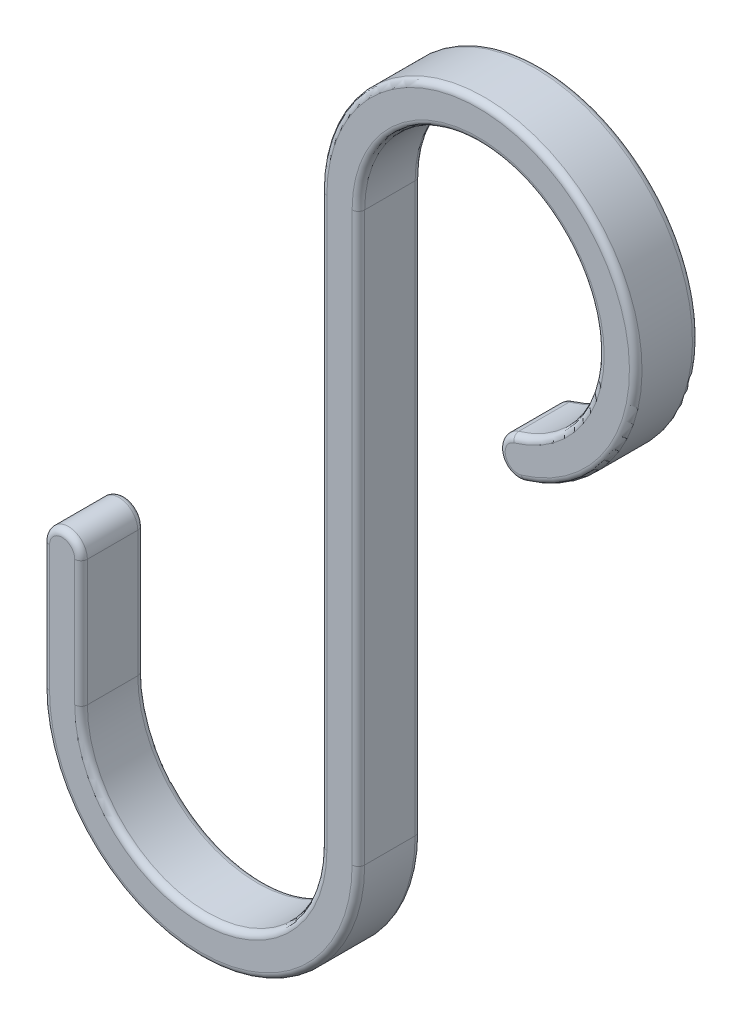
ISO-10303-21;
HEADER;
FILE_DESCRIPTION(('STEP AP214'),'2;1');
FILE_NAME('part.step','',(''),(''),'','','');
FILE_SCHEMA(('AUTOMOTIVE_DESIGN { 1 0 10303 214 1 1 1 1 }'));
ENDSEC;
DATA;
#1=APPLICATION_CONTEXT('core data for automotive mechanical design processes');
#2=APPLICATION_PROTOCOL_DEFINITION('international standard','automotive_design',2000,#1);
#3=PRODUCT_CONTEXT('',#1,'mechanical');
#4=PRODUCT('Part','Part','',(#3));
#5=PRODUCT_RELATED_PRODUCT_CATEGORY('part','',(#4));
#6=PRODUCT_DEFINITION_FORMATION('','',#4);
#7=PRODUCT_DEFINITION_CONTEXT('part definition',#1,'design');
#8=PRODUCT_DEFINITION('design','',#6,#7);
#9=PRODUCT_DEFINITION_SHAPE('','',#8);
#10=(LENGTH_UNIT() NAMED_UNIT(*) SI_UNIT(.MILLI.,.METRE.));
#11=(NAMED_UNIT(*) PLANE_ANGLE_UNIT() SI_UNIT($,.RADIAN.));
#12=(NAMED_UNIT(*) SI_UNIT($,.STERADIAN.) SOLID_ANGLE_UNIT());
#13=UNCERTAINTY_MEASURE_WITH_UNIT(LENGTH_MEASURE(1.E-05),#10,'distance_accuracy_value','');
#14=(GEOMETRIC_REPRESENTATION_CONTEXT(3) GLOBAL_UNCERTAINTY_ASSIGNED_CONTEXT((#13)) GLOBAL_UNIT_ASSIGNED_CONTEXT((#10,
#11,#12)) REPRESENTATION_CONTEXT('',''));
#15=CARTESIAN_POINT('',(0.,0.,0.));
#16=DIRECTION('',(0.,0.,1.));
#17=DIRECTION('',(1.,0.,0.));
#18=AXIS2_PLACEMENT_3D('',#15,#16,#17);
#19=CARTESIAN_POINT('',(-11.,-22.5,5.));
#20=DIRECTION('',(0.,0.,-1.));
#21=DIRECTION('',(-1.,0.,0.));
#22=AXIS2_PLACEMENT_3D('',#19,#20,#21);
#23=CYLINDRICAL_SURFACE('',#22,12.5);
#24=DIRECTION('',(0.,0.,-1.));
#25=VECTOR('',#24,1.);
#26=CARTESIAN_POINT('',(-23.5,-22.5,5.));
#27=LINE('',#26,#25);
#28=CARTESIAN_POINT('',(-23.5,-22.5,4.5));
#29=VERTEX_POINT('',#28);
#30=CARTESIAN_POINT('',(-23.5,-22.5,0.5));
#31=VERTEX_POINT('',#30);
#32=EDGE_CURVE('E219',#29,#31,#27,.T.);
#33=ORIENTED_EDGE('',*,*,#32,.T.);
#34=CARTESIAN_POINT('',(-11.,-22.5,0.5));
#35=DIRECTION('',(0.,0.,-1.));
#36=DIRECTION('',(-1.,0.,0.));
#37=AXIS2_PLACEMENT_3D('',#34,#35,#36);
#38=CIRCLE('',#37,12.5);
#39=CARTESIAN_POINT('',(1.5,-22.5,0.5));
#40=VERTEX_POINT('',#39);
#41=EDGE_CURVE('E297',#31,#40,#38,.F.);
#42=ORIENTED_EDGE('',*,*,#41,.T.);
#43=DIRECTION('',(0.,0.,-1.));
#44=VECTOR('',#43,1.);
#45=CARTESIAN_POINT('',(1.5,-22.5,5.));
#46=LINE('',#45,#44);
#47=CARTESIAN_POINT('',(1.5,-22.5,4.5));
#48=VERTEX_POINT('',#47);
#49=EDGE_CURVE('E211',#48,#40,#46,.T.);
#50=ORIENTED_EDGE('',*,*,#49,.F.);
#51=CARTESIAN_POINT('',(-11.,-22.5,4.5));
#52=DIRECTION('',(0.,0.,-1.));
#53=DIRECTION('',(-1.,0.,0.));
#54=AXIS2_PLACEMENT_3D('',#51,#52,#53);
#55=CIRCLE('',#54,12.5);
#56=EDGE_CURVE('E247',#48,#29,#55,.T.);
#57=ORIENTED_EDGE('',*,*,#56,.T.);
#58=EDGE_LOOP('',(#33,#42,#50,#57));
#59=FACE_BOUND('',#58,.T.);
#60=ADVANCED_FACE('F33',(#59),#23,.T.);
#61=CARTESIAN_POINT('',(1.5,-22.5,5.));
#62=DIRECTION('',(-1.,0.,0.));
#63=DIRECTION('',(0.,-1.,0.));
#64=AXIS2_PLACEMENT_3D('',#61,#62,#63);
#65=PLANE('',#64);
#66=ORIENTED_EDGE('',*,*,#49,.T.);
#67=DIRECTION('',(0.,1.,0.));
#68=VECTOR('',#67,1.);
#69=CARTESIAN_POINT('',(1.5,22.5,0.5));
#70=LINE('',#69,#68);
#71=CARTESIAN_POINT('',(1.5,22.5,0.5));
#72=VERTEX_POINT('',#71);
#73=EDGE_CURVE('E300',#40,#72,#70,.T.);
#74=ORIENTED_EDGE('',*,*,#73,.T.);
#75=DIRECTION('',(0.,0.,-1.));
#76=VECTOR('',#75,1.);
#77=CARTESIAN_POINT('',(1.5,22.5,5.));
#78=LINE('',#77,#76);
#79=CARTESIAN_POINT('',(1.5,22.5,4.5));
#80=VERTEX_POINT('',#79);
#81=EDGE_CURVE('E216',#80,#72,#78,.T.);
#82=ORIENTED_EDGE('',*,*,#81,.F.);
#83=DIRECTION('',(0.,1.,0.));
#84=VECTOR('',#83,1.);
#85=CARTESIAN_POINT('',(1.5,-22.5,4.5));
#86=LINE('',#85,#84);
#87=EDGE_CURVE('E245',#80,#48,#86,.F.);
#88=ORIENTED_EDGE('',*,*,#87,.T.);
#89=EDGE_LOOP('',(#66,#74,#82,#88));
#90=FACE_BOUND('',#89,.T.);
#91=ADVANCED_FACE('F387',(#90),#65,.F.);
#92=CARTESIAN_POINT('',(11.,22.5,5.));
#93=DIRECTION('',(0.,0.,-1.));
#94=DIRECTION('',(-1.,0.,0.));
#95=AXIS2_PLACEMENT_3D('',#92,#93,#94);
#96=CYLINDRICAL_SURFACE('',#95,9.5);
#97=ORIENTED_EDGE('',*,*,#81,.T.);
#98=CARTESIAN_POINT('',(11.,22.5,0.5));
#99=DIRECTION('',(0.,0.,-1.));
#100=DIRECTION('',(-1.,0.,0.));
#101=AXIS2_PLACEMENT_3D('',#98,#99,#100);
#102=CIRCLE('',#101,9.5);
#103=CARTESIAN_POINT('',(13.7136966126587,13.3958333333333,0.5));
#104=VERTEX_POINT('',#103);
#105=EDGE_CURVE('E302',#72,#104,#102,.T.);
#106=ORIENTED_EDGE('',*,*,#105,.T.);
#107=DIRECTION('',(0.,0.,-1.));
#108=VECTOR('',#107,1.);
#109=CARTESIAN_POINT('',(13.7136966126587,13.3958333333333,5.));
#110=LINE('',#109,#108);
#111=CARTESIAN_POINT('',(13.7136966126587,13.3958333333333,4.5));
#112=VERTEX_POINT('',#111);
#113=EDGE_CURVE('E395',#112,#104,#110,.T.);
#114=ORIENTED_EDGE('',*,*,#113,.F.);
#115=CARTESIAN_POINT('',(11.,22.5,4.5));
#116=DIRECTION('',(0.,0.,-1.));
#117=DIRECTION('',(-1.,0.,0.));
#118=AXIS2_PLACEMENT_3D('',#115,#116,#117);
#119=CIRCLE('',#118,9.5);
#120=EDGE_CURVE('E243',#112,#80,#119,.F.);
#121=ORIENTED_EDGE('',*,*,#120,.T.);
#122=EDGE_LOOP('',(#97,#106,#114,#121));
#123=FACE_BOUND('',#122,.T.);
#124=ADVANCED_FACE('F391',(#123),#96,.F.);
#125=CARTESIAN_POINT('',(14.1421750251838,11.9583333333333,5.));
#126=DIRECTION('',(0.,0.,-1.));
#127=DIRECTION('',(-1.,0.,0.));
#128=AXIS2_PLACEMENT_3D('',#125,#126,#127);
#129=CYLINDRICAL_SURFACE('',#128,1.5);
#130=ORIENTED_EDGE('',*,*,#113,.T.);
#131=CARTESIAN_POINT('',(14.1421750251838,11.9583333333333,0.5));
#132=DIRECTION('',(0.,0.,-1.));
#133=DIRECTION('',(-1.,0.,0.));
#134=AXIS2_PLACEMENT_3D('',#131,#132,#133);
#135=CIRCLE('',#134,1.5);
#136=CARTESIAN_POINT('',(14.5706534377089,10.5208333333333,0.5));
#137=VERTEX_POINT('',#136);
#138=EDGE_CURVE('E304',#104,#137,#135,.F.);
#139=ORIENTED_EDGE('',*,*,#138,.T.);
#140=DIRECTION('',(0.,0.,-1.));
#141=VECTOR('',#140,1.);
#142=CARTESIAN_POINT('',(14.5706534377089,10.5208333333333,5.));
#143=LINE('',#142,#141);
#144=CARTESIAN_POINT('',(14.5706534377089,10.5208333333333,4.5));
#145=VERTEX_POINT('',#144);
#146=EDGE_CURVE('E408',#145,#137,#143,.T.);
#147=ORIENTED_EDGE('',*,*,#146,.F.);
#148=CARTESIAN_POINT('',(14.1421750251838,11.9583333333333,4.5));
#149=DIRECTION('',(0.,0.,-1.));
#150=DIRECTION('',(-1.,0.,0.));
#151=AXIS2_PLACEMENT_3D('',#148,#149,#150);
#152=CIRCLE('',#151,1.5);
#153=EDGE_CURVE('E241',#145,#112,#152,.T.);
#154=ORIENTED_EDGE('',*,*,#153,.T.);
#155=EDGE_LOOP('',(#130,#139,#147,#154));
#156=FACE_BOUND('',#155,.T.);
#157=ADVANCED_FACE('F407',(#156),#129,.T.);
#158=CARTESIAN_POINT('',(11.,22.5,5.));
#159=DIRECTION('',(0.,0.,-1.));
#160=DIRECTION('',(-1.,0.,0.));
#161=AXIS2_PLACEMENT_3D('',#158,#159,#160);
#162=CYLINDRICAL_SURFACE('',#161,12.5);
#163=ORIENTED_EDGE('',*,*,#146,.T.);
#164=CARTESIAN_POINT('',(11.,22.5,0.5));
#165=DIRECTION('',(0.,0.,-1.));
#166=DIRECTION('',(-1.,0.,0.));
#167=AXIS2_PLACEMENT_3D('',#164,#165,#166);
#168=CIRCLE('',#167,12.5);
#169=CARTESIAN_POINT('',(-1.5,22.5,0.5));
#170=VERTEX_POINT('',#169);
#171=EDGE_CURVE('E306',#137,#170,#168,.F.);
#172=ORIENTED_EDGE('',*,*,#171,.T.);
#173=DIRECTION('',(0.,0.,-1.));
#174=VECTOR('',#173,1.);
#175=CARTESIAN_POINT('',(-1.5,22.5,5.));
#176=LINE('',#175,#174);
#177=CARTESIAN_POINT('',(-1.5,22.5,4.5));
#178=VERTEX_POINT('',#177);
#179=EDGE_CURVE('E196',#178,#170,#176,.T.);
#180=ORIENTED_EDGE('',*,*,#179,.F.);
#181=CARTESIAN_POINT('',(11.,22.5,4.5));
#182=DIRECTION('',(0.,0.,-1.));
#183=DIRECTION('',(-1.,0.,0.));
#184=AXIS2_PLACEMENT_3D('',#181,#182,#183);
#185=CIRCLE('',#184,12.5);
#186=EDGE_CURVE('E239',#178,#145,#185,.T.);
#187=ORIENTED_EDGE('',*,*,#186,.T.);
#188=EDGE_LOOP('',(#163,#172,#180,#187));
#189=FACE_BOUND('',#188,.T.);
#190=ADVANCED_FACE('F411',(#189),#162,.T.);
#191=CARTESIAN_POINT('',(-1.5,-22.5,5.));
#192=DIRECTION('',(-1.,0.,0.));
#193=DIRECTION('',(0.,-1.,0.));
#194=AXIS2_PLACEMENT_3D('',#191,#192,#193);
#195=PLANE('',#194);
#196=ORIENTED_EDGE('',*,*,#179,.T.);
#197=DIRECTION('',(0.,1.,0.));
#198=VECTOR('',#197,1.);
#199=CARTESIAN_POINT('',(-1.5,-22.5,0.5));
#200=LINE('',#199,#198);
#201=CARTESIAN_POINT('',(-1.5,-22.5,0.5));
#202=VERTEX_POINT('',#201);
#203=EDGE_CURVE('E195',#170,#202,#200,.F.);
#204=ORIENTED_EDGE('',*,*,#203,.T.);
#205=DIRECTION('',(0.,0.,-1.));
#206=VECTOR('',#205,1.);
#207=CARTESIAN_POINT('',(-1.5,-22.5,5.));
#208=LINE('',#207,#206);
#209=CARTESIAN_POINT('',(-1.5,-22.5,4.5));
#210=VERTEX_POINT('',#209);
#211=EDGE_CURVE('E177',#210,#202,#208,.T.);
#212=ORIENTED_EDGE('',*,*,#211,.F.);
#213=DIRECTION('',(0.,1.,0.));
#214=VECTOR('',#213,1.);
#215=CARTESIAN_POINT('',(-1.5,22.5,4.5));
#216=LINE('',#215,#214);
#217=EDGE_CURVE('E192',#210,#178,#216,.T.);
#218=ORIENTED_EDGE('',*,*,#217,.T.);
#219=EDGE_LOOP('',(#196,#204,#212,#218));
#220=FACE_BOUND('',#219,.T.);
#221=ADVANCED_FACE('F190',(#220),#195,.T.);
#222=CARTESIAN_POINT('',(-11.,-22.5,5.));
#223=DIRECTION('',(0.,0.,-1.));
#224=DIRECTION('',(-1.,0.,0.));
#225=AXIS2_PLACEMENT_3D('',#222,#223,#224);
#226=CYLINDRICAL_SURFACE('',#225,9.5);
#227=ORIENTED_EDGE('',*,*,#211,.T.);
#228=CARTESIAN_POINT('',(-11.,-22.5,0.5));
#229=DIRECTION('',(0.,0.,-1.));
#230=DIRECTION('',(-1.,0.,0.));
#231=AXIS2_PLACEMENT_3D('',#228,#229,#230);
#232=CIRCLE('',#231,9.5);
#233=CARTESIAN_POINT('',(-20.5,-22.5,0.5));
#234=VERTEX_POINT('',#233);
#235=EDGE_CURVE('E309',#202,#234,#232,.T.);
#236=ORIENTED_EDGE('',*,*,#235,.T.);
#237=DIRECTION('',(0.,0.,-1.));
#238=VECTOR('',#237,1.);
#239=CARTESIAN_POINT('',(-20.5,-22.5,5.));
#240=LINE('',#239,#238);
#241=CARTESIAN_POINT('',(-20.5,-22.5,4.5));
#242=VERTEX_POINT('',#241);
#243=EDGE_CURVE('E179',#242,#234,#240,.T.);
#244=ORIENTED_EDGE('',*,*,#243,.F.);
#245=CARTESIAN_POINT('',(-11.,-22.5,4.5));
#246=DIRECTION('',(0.,0.,-1.));
#247=DIRECTION('',(-1.,0.,0.));
#248=AXIS2_PLACEMENT_3D('',#245,#246,#247);
#249=CIRCLE('',#248,9.5);
#250=EDGE_CURVE('E174',#242,#210,#249,.F.);
#251=ORIENTED_EDGE('',*,*,#250,.T.);
#252=EDGE_LOOP('',(#227,#236,#244,#251));
#253=FACE_BOUND('',#252,.T.);
#254=ADVANCED_FACE('F176',(#253),#226,.F.);
#255=CARTESIAN_POINT('',(-20.5,-22.5,5.));
#256=DIRECTION('',(-1.,0.,0.));
#257=DIRECTION('',(0.,0.,1.));
#258=AXIS2_PLACEMENT_3D('',#255,#256,#257);
#259=PLANE('',#258);
#260=ORIENTED_EDGE('',*,*,#243,.T.);
#261=DIRECTION('',(0.,1.,0.));
#262=VECTOR('',#261,1.);
#263=CARTESIAN_POINT('',(-20.5,-12.5,0.5));
#264=LINE('',#263,#262);
#265=CARTESIAN_POINT('',(-20.5,-12.5,0.5));
#266=VERTEX_POINT('',#265);
#267=EDGE_CURVE('E57',#234,#266,#264,.T.);
#268=ORIENTED_EDGE('',*,*,#267,.T.);
#269=DIRECTION('',(0.,0.,-1.));
#270=VECTOR('',#269,1.);
#271=CARTESIAN_POINT('',(-20.5,-12.5,5.));
#272=LINE('',#271,#270);
#273=CARTESIAN_POINT('',(-20.5,-12.5,4.5));
#274=VERTEX_POINT('',#273);
#275=EDGE_CURVE('E352',#274,#266,#272,.T.);
#276=ORIENTED_EDGE('',*,*,#275,.F.);
#277=DIRECTION('',(0.,1.,0.));
#278=VECTOR('',#277,1.);
#279=CARTESIAN_POINT('',(-20.5,-22.5,4.5));
#280=LINE('',#279,#278);
#281=EDGE_CURVE('E185',#274,#242,#280,.F.);
#282=ORIENTED_EDGE('',*,*,#281,.T.);
#283=EDGE_LOOP('',(#260,#268,#276,#282));
#284=FACE_BOUND('',#283,.T.);
#285=ADVANCED_FACE('F350',(#284),#259,.F.);
#286=CARTESIAN_POINT('',(-22.,-12.5,5.));
#287=DIRECTION('',(0.,0.,-1.));
#288=DIRECTION('',(-1.,0.,0.));
#289=AXIS2_PLACEMENT_3D('',#286,#287,#288);
#290=CYLINDRICAL_SURFACE('',#289,1.5);
#291=ORIENTED_EDGE('',*,*,#275,.T.);
#292=CARTESIAN_POINT('',(-22.,-12.5,0.5));
#293=DIRECTION('',(0.,0.,-1.));
#294=DIRECTION('',(-1.,0.,0.));
#295=AXIS2_PLACEMENT_3D('',#292,#293,#294);
#296=CIRCLE('',#295,1.5);
#297=CARTESIAN_POINT('',(-23.5,-12.5,0.5));
#298=VERTEX_POINT('',#297);
#299=EDGE_CURVE('E42',#266,#298,#296,.F.);
#300=ORIENTED_EDGE('',*,*,#299,.T.);
#301=DIRECTION('',(0.,0.,-1.));
#302=VECTOR('',#301,1.);
#303=CARTESIAN_POINT('',(-23.5,-12.5,5.));
#304=LINE('',#303,#302);
#305=CARTESIAN_POINT('',(-23.5,-12.5,4.5));
#306=VERTEX_POINT('',#305);
#307=EDGE_CURVE('E354',#306,#298,#304,.T.);
#308=ORIENTED_EDGE('',*,*,#307,.F.);
#309=CARTESIAN_POINT('',(-22.,-12.5,4.5));
#310=DIRECTION('',(0.,0.,-1.));
#311=DIRECTION('',(-1.,0.,0.));
#312=AXIS2_PLACEMENT_3D('',#309,#310,#311);
#313=CIRCLE('',#312,1.5);
#314=EDGE_CURVE('E251',#306,#274,#313,.T.);
#315=ORIENTED_EDGE('',*,*,#314,.T.);
#316=EDGE_LOOP('',(#291,#300,#308,#315));
#317=FACE_BOUND('',#316,.T.);
#318=ADVANCED_FACE('F440',(#317),#290,.T.);
#319=CARTESIAN_POINT('',(-23.5,-22.5,5.));
#320=DIRECTION('',(-1.,0.,0.));
#321=DIRECTION('',(0.,0.,1.));
#322=AXIS2_PLACEMENT_3D('',#319,#320,#321);
#323=PLANE('',#322);
#324=ORIENTED_EDGE('',*,*,#307,.T.);
#325=DIRECTION('',(0.,1.,0.));
#326=VECTOR('',#325,1.);
#327=CARTESIAN_POINT('',(-23.5,-22.5,0.5));
#328=LINE('',#327,#326);
#329=EDGE_CURVE('E11',#298,#31,#328,.F.);
#330=ORIENTED_EDGE('',*,*,#329,.T.);
#331=ORIENTED_EDGE('',*,*,#32,.F.);
#332=DIRECTION('',(0.,1.,0.));
#333=VECTOR('',#332,1.);
#334=CARTESIAN_POINT('',(-23.5,-12.5,4.5));
#335=LINE('',#334,#333);
#336=EDGE_CURVE('E249',#29,#306,#335,.T.);
#337=ORIENTED_EDGE('',*,*,#336,.T.);
#338=EDGE_LOOP('',(#324,#330,#331,#337));
#339=FACE_BOUND('',#338,.T.);
#340=ADVANCED_FACE('F439',(#339),#323,.T.);
#341=CARTESIAN_POINT('',(-11.,-22.5,5.));
#342=DIRECTION('',(0.,0.,-1.));
#343=DIRECTION('',(-1.,0.,0.));
#344=AXIS2_PLACEMENT_3D('',#341,#342,#343);
#345=PLANE('',#344);
#346=CARTESIAN_POINT('',(11.,22.5,5.));
#347=DIRECTION('',(0.,0.,-1.));
#348=DIRECTION('',(-1.,0.,0.));
#349=AXIS2_PLACEMENT_3D('',#346,#347,#348);
#350=CIRCLE('',#349,12.);
#351=CARTESIAN_POINT('',(14.4278273002005,11.,5.));
#352=VERTEX_POINT('',#351);
#353=CARTESIAN_POINT('',(-0.999999999999997,22.5,5.));
#354=VERTEX_POINT('',#353);
#355=EDGE_CURVE('E235',#352,#354,#350,.F.);
#356=ORIENTED_EDGE('',*,*,#355,.T.);
#357=DIRECTION('',(0.,1.,0.));
#358=VECTOR('',#357,1.);
#359=CARTESIAN_POINT('',(-1.,-22.5,5.));
#360=LINE('',#359,#358);
#361=CARTESIAN_POINT('',(-1.,-22.5,5.));
#362=VERTEX_POINT('',#361);
#363=EDGE_CURVE('E237',#354,#362,#360,.F.);
#364=ORIENTED_EDGE('',*,*,#363,.T.);
#365=CARTESIAN_POINT('',(-11.,-22.5,5.));
#366=DIRECTION('',(0.,0.,-1.));
#367=DIRECTION('',(-1.,0.,0.));
#368=AXIS2_PLACEMENT_3D('',#365,#366,#367);
#369=CIRCLE('',#368,10.);
#370=CARTESIAN_POINT('',(-21.,-22.5,5.));
#371=VERTEX_POINT('',#370);
#372=EDGE_CURVE('E201',#362,#371,#369,.T.);
#373=ORIENTED_EDGE('',*,*,#372,.T.);
#374=DIRECTION('',(0.,1.,0.));
#375=VECTOR('',#374,1.);
#376=CARTESIAN_POINT('',(-21.,-22.5,5.));
#377=LINE('',#376,#375);
#378=CARTESIAN_POINT('',(-21.,-12.5,5.));
#379=VERTEX_POINT('',#378);
#380=EDGE_CURVE('E213',#371,#379,#377,.T.);
#381=ORIENTED_EDGE('',*,*,#380,.T.);
#382=CARTESIAN_POINT('',(-22.,-12.5,5.));
#383=DIRECTION('',(0.,0.,-1.));
#384=DIRECTION('',(-1.,0.,0.));
#385=AXIS2_PLACEMENT_3D('',#382,#383,#384);
#386=CIRCLE('',#385,1.);
#387=CARTESIAN_POINT('',(-23.,-12.5,5.));
#388=VERTEX_POINT('',#387);
#389=EDGE_CURVE('E223',#379,#388,#386,.F.);
#390=ORIENTED_EDGE('',*,*,#389,.T.);
#391=DIRECTION('',(0.,1.,0.));
#392=VECTOR('',#391,1.);
#393=CARTESIAN_POINT('',(-23.,-22.5,5.));
#394=LINE('',#393,#392);
#395=CARTESIAN_POINT('',(-23.,-22.5,5.));
#396=VERTEX_POINT('',#395);
#397=EDGE_CURVE('E225',#388,#396,#394,.F.);
#398=ORIENTED_EDGE('',*,*,#397,.T.);
#399=CARTESIAN_POINT('',(-11.,-22.5,5.));
#400=DIRECTION('',(0.,0.,-1.));
#401=DIRECTION('',(-1.,0.,0.));
#402=AXIS2_PLACEMENT_3D('',#399,#400,#401);
#403=CIRCLE('',#402,12.);
#404=CARTESIAN_POINT('',(0.999999999999999,-22.5,5.));
#405=VERTEX_POINT('',#404);
#406=EDGE_CURVE('E227',#396,#405,#403,.F.);
#407=ORIENTED_EDGE('',*,*,#406,.T.);
#408=DIRECTION('',(0.,1.,0.));
#409=VECTOR('',#408,1.);
#410=CARTESIAN_POINT('',(0.999999999999997,-22.5,5.));
#411=LINE('',#410,#409);
#412=CARTESIAN_POINT('',(1.,22.5,5.));
#413=VERTEX_POINT('',#412);
#414=EDGE_CURVE('E229',#405,#413,#411,.T.);
#415=ORIENTED_EDGE('',*,*,#414,.T.);
#416=CARTESIAN_POINT('',(11.,22.5,5.));
#417=DIRECTION('',(0.,0.,-1.));
#418=DIRECTION('',(-1.,0.,0.));
#419=AXIS2_PLACEMENT_3D('',#416,#417,#418);
#420=CIRCLE('',#419,10.);
#421=CARTESIAN_POINT('',(13.8565227501671,12.9166666666667,5.));
#422=VERTEX_POINT('',#421);
#423=EDGE_CURVE('E231',#413,#422,#420,.T.);
#424=ORIENTED_EDGE('',*,*,#423,.T.);
#425=CARTESIAN_POINT('',(14.1421750251838,11.9583333333333,5.));
#426=DIRECTION('',(0.,0.,-1.));
#427=DIRECTION('',(-1.,0.,0.));
#428=AXIS2_PLACEMENT_3D('',#425,#426,#427);
#429=CIRCLE('',#428,0.999999999999999);
#430=EDGE_CURVE('E233',#422,#352,#429,.F.);
#431=ORIENTED_EDGE('',*,*,#430,.T.);
#432=EDGE_LOOP('',(#356,#364,#373,#381,#390,#398,#407,#415,#424,#431));
#433=FACE_BOUND('',#432,.T.);
#434=ADVANCED_FACE('F450',(#433),#345,.F.);
#435=CARTESIAN_POINT('',(-11.,-22.5,0.));
#436=DIRECTION('',(0.,0.,-1.));
#437=DIRECTION('',(-1.,0.,0.));
#438=AXIS2_PLACEMENT_3D('',#435,#436,#437);
#439=PLANE('',#438);
#440=DIRECTION('',(0.,1.,0.));
#441=VECTOR('',#440,1.);
#442=CARTESIAN_POINT('',(0.999999999999998,-22.5,0.));
#443=LINE('',#442,#441);
#444=CARTESIAN_POINT('',(1.,22.5,0.));
#445=VERTEX_POINT('',#444);
#446=CARTESIAN_POINT('',(0.999999999999998,-22.5,0.));
#447=VERTEX_POINT('',#446);
#448=EDGE_CURVE('E292',#445,#447,#443,.F.);
#449=ORIENTED_EDGE('',*,*,#448,.T.);
#450=CARTESIAN_POINT('',(-11.,-22.5,0.));
#451=DIRECTION('',(0.,0.,-1.));
#452=DIRECTION('',(-1.,0.,0.));
#453=AXIS2_PLACEMENT_3D('',#450,#451,#452);
#454=CIRCLE('',#453,12.);
#455=CARTESIAN_POINT('',(-23.,-22.5,0.));
#456=VERTEX_POINT('',#455);
#457=EDGE_CURVE('E294',#447,#456,#454,.T.);
#458=ORIENTED_EDGE('',*,*,#457,.T.);
#459=DIRECTION('',(0.,1.,0.));
#460=VECTOR('',#459,1.);
#461=CARTESIAN_POINT('',(-23.,-22.5,0.));
#462=LINE('',#461,#460);
#463=CARTESIAN_POINT('',(-23.,-12.5,0.));
#464=VERTEX_POINT('',#463);
#465=EDGE_CURVE('E184',#456,#464,#462,.T.);
#466=ORIENTED_EDGE('',*,*,#465,.T.);
#467=CARTESIAN_POINT('',(-22.,-12.5,0.));
#468=DIRECTION('',(0.,0.,-1.));
#469=DIRECTION('',(-1.,0.,0.));
#470=AXIS2_PLACEMENT_3D('',#467,#468,#469);
#471=CIRCLE('',#470,1.);
#472=CARTESIAN_POINT('',(-21.,-12.5,0.));
#473=VERTEX_POINT('',#472);
#474=EDGE_CURVE('E278',#464,#473,#471,.T.);
#475=ORIENTED_EDGE('',*,*,#474,.T.);
#476=DIRECTION('',(0.,1.,0.));
#477=VECTOR('',#476,1.);
#478=CARTESIAN_POINT('',(-21.,-22.5,0.));
#479=LINE('',#478,#477);
#480=CARTESIAN_POINT('',(-21.,-22.5,0.));
#481=VERTEX_POINT('',#480);
#482=EDGE_CURVE('E280',#473,#481,#479,.F.);
#483=ORIENTED_EDGE('',*,*,#482,.T.);
#484=CARTESIAN_POINT('',(-11.,-22.5,0.));
#485=DIRECTION('',(0.,0.,-1.));
#486=DIRECTION('',(-1.,0.,0.));
#487=AXIS2_PLACEMENT_3D('',#484,#485,#486);
#488=CIRCLE('',#487,10.);
#489=CARTESIAN_POINT('',(-1.,-22.5,0.));
#490=VERTEX_POINT('',#489);
#491=EDGE_CURVE('E282',#481,#490,#488,.F.);
#492=ORIENTED_EDGE('',*,*,#491,.T.);
#493=DIRECTION('',(0.,1.,0.));
#494=VECTOR('',#493,1.);
#495=CARTESIAN_POINT('',(-0.999999999999999,-22.5,0.));
#496=LINE('',#495,#494);
#497=CARTESIAN_POINT('',(-1.,22.5,0.));
#498=VERTEX_POINT('',#497);
#499=EDGE_CURVE('E284',#490,#498,#496,.T.);
#500=ORIENTED_EDGE('',*,*,#499,.T.);
#501=CARTESIAN_POINT('',(11.,22.5,0.));
#502=DIRECTION('',(0.,0.,-1.));
#503=DIRECTION('',(-1.,0.,0.));
#504=AXIS2_PLACEMENT_3D('',#501,#502,#503);
#505=CIRCLE('',#504,12.);
#506=CARTESIAN_POINT('',(14.4278273002005,11.,0.));
#507=VERTEX_POINT('',#506);
#508=EDGE_CURVE('E286',#498,#507,#505,.T.);
#509=ORIENTED_EDGE('',*,*,#508,.T.);
#510=CARTESIAN_POINT('',(14.1421750251838,11.9583333333333,0.));
#511=DIRECTION('',(0.,0.,-1.));
#512=DIRECTION('',(-1.,0.,0.));
#513=AXIS2_PLACEMENT_3D('',#510,#511,#512);
#514=CIRCLE('',#513,0.999999999999999);
#515=CARTESIAN_POINT('',(13.8565227501671,12.9166666666667,0.));
#516=VERTEX_POINT('',#515);
#517=EDGE_CURVE('E288',#507,#516,#514,.T.);
#518=ORIENTED_EDGE('',*,*,#517,.T.);
#519=CARTESIAN_POINT('',(11.,22.5,0.));
#520=DIRECTION('',(0.,0.,-1.));
#521=DIRECTION('',(-1.,0.,0.));
#522=AXIS2_PLACEMENT_3D('',#519,#520,#521);
#523=CIRCLE('',#522,10.);
#524=EDGE_CURVE('E290',#516,#445,#523,.F.);
#525=ORIENTED_EDGE('',*,*,#524,.T.);
#526=EDGE_LOOP('',(#449,#458,#466,#475,#483,#492,#500,#509,#518,#525));
#527=FACE_BOUND('',#526,.T.);
#528=ADVANCED_FACE('F378',(#527),#439,.T.);
#529=CARTESIAN_POINT('',(-11.,-22.5,4.5));
#530=DIRECTION('',(0.,0.,-1.));
#531=DIRECTION('',(-1.,0.,0.));
#532=AXIS2_PLACEMENT_3D('',#529,#530,#531);
#533=TOROIDAL_SURFACE('',#532,12.,0.5);
#534=CARTESIAN_POINT('',(0.999999999999999,-22.5,4.5));
#535=DIRECTION('',(0.,1.,0.));
#536=DIRECTION('',(0.,0.,1.));
#537=AXIS2_PLACEMENT_3D('',#534,#535,#536);
#538=CIRCLE('',#537,0.5);
#539=EDGE_CURVE('E271',#405,#48,#538,.T.);
#540=ORIENTED_EDGE('',*,*,#539,.F.);
#541=ORIENTED_EDGE('',*,*,#406,.F.);
#542=CARTESIAN_POINT('',(-23.,-22.5,4.5));
#543=DIRECTION('',(0.,1.,0.));
#544=DIRECTION('',(0.,0.,1.));
#545=AXIS2_PLACEMENT_3D('',#542,#543,#544);
#546=CIRCLE('',#545,0.5);
#547=EDGE_CURVE('E274',#29,#396,#546,.T.);
#548=ORIENTED_EDGE('',*,*,#547,.F.);
#549=ORIENTED_EDGE('',*,*,#56,.F.);
#550=EDGE_LOOP('',(#540,#541,#548,#549));
#551=FACE_BOUND('',#550,.T.);
#552=ADVANCED_FACE('F431',(#551),#533,.T.);
#553=CARTESIAN_POINT('',(-23.,-22.5,4.5));
#554=DIRECTION('',(0.,-1.,0.));
#555=DIRECTION('',(0.,0.,-1.));
#556=AXIS2_PLACEMENT_3D('',#553,#554,#555);
#557=CYLINDRICAL_SURFACE('',#556,0.5);
#558=ORIENTED_EDGE('',*,*,#547,.T.);
#559=ORIENTED_EDGE('',*,*,#397,.F.);
#560=CARTESIAN_POINT('',(-23.,-12.5,4.5));
#561=DIRECTION('',(0.,1.,0.));
#562=DIRECTION('',(0.,0.,1.));
#563=AXIS2_PLACEMENT_3D('',#560,#561,#562);
#564=CIRCLE('',#563,0.5);
#565=EDGE_CURVE('E268',#306,#388,#564,.T.);
#566=ORIENTED_EDGE('',*,*,#565,.F.);
#567=ORIENTED_EDGE('',*,*,#336,.F.);
#568=EDGE_LOOP('',(#558,#559,#566,#567));
#569=FACE_BOUND('',#568,.T.);
#570=ADVANCED_FACE('F437',(#569),#557,.T.);
#571=CARTESIAN_POINT('',(0.999999999999997,-22.5,4.5));
#572=DIRECTION('',(0.,1.,0.));
#573=DIRECTION('',(-1.,0.,0.));
#574=AXIS2_PLACEMENT_3D('',#571,#572,#573);
#575=CYLINDRICAL_SURFACE('',#574,0.5);
#576=ORIENTED_EDGE('',*,*,#539,.T.);
#577=ORIENTED_EDGE('',*,*,#87,.F.);
#578=CARTESIAN_POINT('',(1.,22.5,4.5));
#579=DIRECTION('',(0.,1.,0.));
#580=DIRECTION('',(0.,0.,1.));
#581=AXIS2_PLACEMENT_3D('',#578,#579,#580);
#582=CIRCLE('',#581,0.5);
#583=EDGE_CURVE('E265',#413,#80,#582,.T.);
#584=ORIENTED_EDGE('',*,*,#583,.F.);
#585=ORIENTED_EDGE('',*,*,#414,.F.);
#586=EDGE_LOOP('',(#576,#577,#584,#585));
#587=FACE_BOUND('',#586,.T.);
#588=ADVANCED_FACE('F428',(#587),#575,.T.);
#589=CARTESIAN_POINT('',(-22.,-12.5,4.5));
#590=DIRECTION('',(0.,0.,-1.));
#591=DIRECTION('',(-1.,0.,0.));
#592=AXIS2_PLACEMENT_3D('',#589,#590,#591);
#593=TOROIDAL_SURFACE('',#592,1.,0.5);
#594=ORIENTED_EDGE('',*,*,#565,.T.);
#595=ORIENTED_EDGE('',*,*,#389,.F.);
#596=CARTESIAN_POINT('',(-21.,-12.5,4.5));
#597=DIRECTION('',(0.,-1.,0.));
#598=DIRECTION('',(0.,0.,-1.));
#599=AXIS2_PLACEMENT_3D('',#596,#597,#598);
#600=CIRCLE('',#599,0.5);
#601=EDGE_CURVE('E262',#274,#379,#600,.T.);
#602=ORIENTED_EDGE('',*,*,#601,.F.);
#603=ORIENTED_EDGE('',*,*,#314,.F.);
#604=EDGE_LOOP('',(#594,#595,#602,#603));
#605=FACE_BOUND('',#604,.T.);
#606=ADVANCED_FACE('F445',(#605),#593,.T.);
#607=CARTESIAN_POINT('',(11.,22.5,4.5));
#608=DIRECTION('',(0.,0.,-1.));
#609=DIRECTION('',(-1.,0.,0.));
#610=AXIS2_PLACEMENT_3D('',#607,#608,#609);
#611=TOROIDAL_SURFACE('',#610,10.,0.5);
#612=ORIENTED_EDGE('',*,*,#583,.T.);
#613=ORIENTED_EDGE('',*,*,#120,.F.);
#614=CARTESIAN_POINT('',(13.8565227501671,12.9166666666667,4.5));
#615=DIRECTION('',(-0.958333333333332,-0.285652275016715,0.));
#616=DIRECTION('',(0.285652275016715,-0.958333333333332,0.));
#617=AXIS2_PLACEMENT_3D('',#614,#615,#616);
#618=CIRCLE('',#617,0.5);
#619=EDGE_CURVE('E259',#422,#112,#618,.T.);
#620=ORIENTED_EDGE('',*,*,#619,.F.);
#621=ORIENTED_EDGE('',*,*,#423,.F.);
#622=EDGE_LOOP('',(#612,#613,#620,#621));
#623=FACE_BOUND('',#622,.T.);
#624=ADVANCED_FACE('F423',(#623),#611,.T.);
#625=CARTESIAN_POINT('',(-21.,-22.5,4.5));
#626=DIRECTION('',(0.,1.,0.));
#627=DIRECTION('',(0.,0.,1.));
#628=AXIS2_PLACEMENT_3D('',#625,#626,#627);
#629=CYLINDRICAL_SURFACE('',#628,0.5);
#630=ORIENTED_EDGE('',*,*,#601,.T.);
#631=ORIENTED_EDGE('',*,*,#380,.F.);
#632=CARTESIAN_POINT('',(-21.,-22.5,4.5));
#633=DIRECTION('',(0.,-1.,0.));
#634=DIRECTION('',(0.,0.,-1.));
#635=AXIS2_PLACEMENT_3D('',#632,#633,#634);
#636=CIRCLE('',#635,0.5);
#637=EDGE_CURVE('E257',#242,#371,#636,.T.);
#638=ORIENTED_EDGE('',*,*,#637,.F.);
#639=ORIENTED_EDGE('',*,*,#281,.F.);
#640=EDGE_LOOP('',(#630,#631,#638,#639));
#641=FACE_BOUND('',#640,.T.);
#642=ADVANCED_FACE('F448',(#641),#629,.T.);
#643=CARTESIAN_POINT('',(14.1421750251838,11.9583333333333,4.5));
#644=DIRECTION('',(0.,0.,-1.));
#645=DIRECTION('',(-1.,0.,0.));
#646=AXIS2_PLACEMENT_3D('',#643,#644,#645);
#647=TOROIDAL_SURFACE('',#646,0.999999999999999,0.5);
#648=ORIENTED_EDGE('',*,*,#619,.T.);
#649=ORIENTED_EDGE('',*,*,#153,.F.);
#650=CARTESIAN_POINT('',(14.4278273002005,11.,4.5));
#651=DIRECTION('',(0.958333333333334,0.285652275016708,0.));
#652=DIRECTION('',(-0.285652275016708,0.958333333333334,0.));
#653=AXIS2_PLACEMENT_3D('',#650,#651,#652);
#654=CIRCLE('',#653,0.5);
#655=EDGE_CURVE('E205',#352,#145,#654,.T.);
#656=ORIENTED_EDGE('',*,*,#655,.F.);
#657=ORIENTED_EDGE('',*,*,#430,.F.);
#658=EDGE_LOOP('',(#648,#649,#656,#657));
#659=FACE_BOUND('',#658,.T.);
#660=ADVANCED_FACE('F420',(#659),#647,.T.);
#661=CARTESIAN_POINT('',(-11.,-22.5,4.5));
#662=DIRECTION('',(0.,0.,-1.));
#663=DIRECTION('',(-1.,0.,0.));
#664=AXIS2_PLACEMENT_3D('',#661,#662,#663);
#665=TOROIDAL_SURFACE('',#664,10.,0.5);
#666=ORIENTED_EDGE('',*,*,#637,.T.);
#667=ORIENTED_EDGE('',*,*,#372,.F.);
#668=CARTESIAN_POINT('',(-1.,-22.5,4.5));
#669=DIRECTION('',(0.,1.,0.));
#670=DIRECTION('',(0.,0.,1.));
#671=AXIS2_PLACEMENT_3D('',#668,#669,#670);
#672=CIRCLE('',#671,0.5);
#673=EDGE_CURVE('E199',#210,#362,#672,.T.);
#674=ORIENTED_EDGE('',*,*,#673,.F.);
#675=ORIENTED_EDGE('',*,*,#250,.F.);
#676=EDGE_LOOP('',(#666,#667,#674,#675));
#677=FACE_BOUND('',#676,.T.);
#678=ADVANCED_FACE('F200',(#677),#665,.T.);
#679=CARTESIAN_POINT('',(11.,22.5,4.5));
#680=DIRECTION('',(0.,0.,-1.));
#681=DIRECTION('',(-1.,0.,0.));
#682=AXIS2_PLACEMENT_3D('',#679,#680,#681);
#683=TOROIDAL_SURFACE('',#682,12.,0.5);
#684=ORIENTED_EDGE('',*,*,#655,.T.);
#685=ORIENTED_EDGE('',*,*,#186,.F.);
#686=CARTESIAN_POINT('',(-0.999999999999997,22.5,4.5));
#687=DIRECTION('',(0.,-1.,0.));
#688=DIRECTION('',(0.,0.,-1.));
#689=AXIS2_PLACEMENT_3D('',#686,#687,#688);
#690=CIRCLE('',#689,0.5);
#691=EDGE_CURVE('E206',#354,#178,#690,.T.);
#692=ORIENTED_EDGE('',*,*,#691,.F.);
#693=ORIENTED_EDGE('',*,*,#355,.F.);
#694=EDGE_LOOP('',(#684,#685,#692,#693));
#695=FACE_BOUND('',#694,.T.);
#696=ADVANCED_FACE('F415',(#695),#683,.T.);
#697=CARTESIAN_POINT('',(-1.,-22.5,4.5));
#698=DIRECTION('',(0.,-1.,0.));
#699=DIRECTION('',(1.,0.,0.));
#700=AXIS2_PLACEMENT_3D('',#697,#698,#699);
#701=CYLINDRICAL_SURFACE('',#700,0.5);
#702=ORIENTED_EDGE('',*,*,#673,.T.);
#703=ORIENTED_EDGE('',*,*,#363,.F.);
#704=ORIENTED_EDGE('',*,*,#691,.T.);
#705=ORIENTED_EDGE('',*,*,#217,.F.);
#706=EDGE_LOOP('',(#702,#703,#704,#705));
#707=FACE_BOUND('',#706,.T.);
#708=ADVANCED_FACE('F208',(#707),#701,.T.);
#709=CARTESIAN_POINT('',(-0.999999999999999,-22.5,0.5));
#710=DIRECTION('',(0.,1.,0.));
#711=DIRECTION('',(-1.,0.,0.));
#712=AXIS2_PLACEMENT_3D('',#709,#710,#711);
#713=CYLINDRICAL_SURFACE('',#712,0.5);
#714=CARTESIAN_POINT('',(-1.,-22.5,0.5));
#715=DIRECTION('',(0.,-1.,0.));
#716=DIRECTION('',(0.,0.,-1.));
#717=AXIS2_PLACEMENT_3D('',#714,#715,#716);
#718=CIRCLE('',#717,0.5);
#719=EDGE_CURVE('E334',#202,#490,#718,.T.);
#720=ORIENTED_EDGE('',*,*,#719,.F.);
#721=ORIENTED_EDGE('',*,*,#203,.F.);
#722=CARTESIAN_POINT('',(-1.,22.5,0.5));
#723=DIRECTION('',(0.,1.,0.));
#724=DIRECTION('',(0.,0.,1.));
#725=AXIS2_PLACEMENT_3D('',#722,#723,#724);
#726=CIRCLE('',#725,0.5);
#727=EDGE_CURVE('E37',#498,#170,#726,.T.);
#728=ORIENTED_EDGE('',*,*,#727,.F.);
#729=ORIENTED_EDGE('',*,*,#499,.F.);
#730=EDGE_LOOP('',(#720,#721,#728,#729));
#731=FACE_BOUND('',#730,.T.);
#732=ADVANCED_FACE('F35',(#731),#713,.T.);
#733=CARTESIAN_POINT('',(11.,22.5,0.5));
#734=DIRECTION('',(0.,0.,-1.));
#735=DIRECTION('',(-1.,0.,0.));
#736=AXIS2_PLACEMENT_3D('',#733,#734,#735);
#737=TOROIDAL_SURFACE('',#736,12.,0.5);
#738=ORIENTED_EDGE('',*,*,#727,.T.);
#739=ORIENTED_EDGE('',*,*,#171,.F.);
#740=CARTESIAN_POINT('',(14.4278273002005,11.,0.5));
#741=DIRECTION('',(-0.958333333333334,-0.285652275016708,0.));
#742=DIRECTION('',(0.285652275016708,-0.958333333333334,0.));
#743=AXIS2_PLACEMENT_3D('',#740,#741,#742);
#744=CIRCLE('',#743,0.5);
#745=EDGE_CURVE('E332',#507,#137,#744,.T.);
#746=ORIENTED_EDGE('',*,*,#745,.F.);
#747=ORIENTED_EDGE('',*,*,#508,.F.);
#748=EDGE_LOOP('',(#738,#739,#746,#747));
#749=FACE_BOUND('',#748,.T.);
#750=ADVANCED_FACE('F344',(#749),#737,.T.);
#751=CARTESIAN_POINT('',(-11.,-22.5,0.5));
#752=DIRECTION('',(0.,0.,-1.));
#753=DIRECTION('',(-1.,0.,0.));
#754=AXIS2_PLACEMENT_3D('',#751,#752,#753);
#755=TOROIDAL_SURFACE('',#754,10.,0.5);
#756=ORIENTED_EDGE('',*,*,#719,.T.);
#757=ORIENTED_EDGE('',*,*,#491,.F.);
#758=CARTESIAN_POINT('',(-21.,-22.5,0.5));
#759=DIRECTION('',(0.,1.,0.));
#760=DIRECTION('',(0.,0.,1.));
#761=AXIS2_PLACEMENT_3D('',#758,#759,#760);
#762=CIRCLE('',#761,0.5);
#763=EDGE_CURVE('E329',#234,#481,#762,.T.);
#764=ORIENTED_EDGE('',*,*,#763,.F.);
#765=ORIENTED_EDGE('',*,*,#235,.F.);
#766=EDGE_LOOP('',(#756,#757,#764,#765));
#767=FACE_BOUND('',#766,.T.);
#768=ADVANCED_FACE('F349',(#767),#755,.T.);
#769=CARTESIAN_POINT('',(14.1421750251838,11.9583333333333,0.5));
#770=DIRECTION('',(0.,0.,-1.));
#771=DIRECTION('',(-1.,0.,0.));
#772=AXIS2_PLACEMENT_3D('',#769,#770,#771);
#773=TOROIDAL_SURFACE('',#772,0.999999999999999,0.5);
#774=ORIENTED_EDGE('',*,*,#745,.T.);
#775=ORIENTED_EDGE('',*,*,#138,.F.);
#776=CARTESIAN_POINT('',(13.8565227501671,12.9166666666667,0.5));
#777=DIRECTION('',(0.958333333333334,0.285652275016708,0.));
#778=DIRECTION('',(-0.285652275016708,0.958333333333334,0.));
#779=AXIS2_PLACEMENT_3D('',#776,#777,#778);
#780=CIRCLE('',#779,0.5);
#781=EDGE_CURVE('E326',#516,#104,#780,.T.);
#782=ORIENTED_EDGE('',*,*,#781,.F.);
#783=ORIENTED_EDGE('',*,*,#517,.F.);
#784=EDGE_LOOP('',(#774,#775,#782,#783));
#785=FACE_BOUND('',#784,.T.);
#786=ADVANCED_FACE('F403',(#785),#773,.T.);
#787=CARTESIAN_POINT('',(-21.,-22.5,0.5));
#788=DIRECTION('',(0.,-1.,0.));
#789=DIRECTION('',(0.,0.,-1.));
#790=AXIS2_PLACEMENT_3D('',#787,#788,#789);
#791=CYLINDRICAL_SURFACE('',#790,0.5);
#792=ORIENTED_EDGE('',*,*,#763,.T.);
#793=ORIENTED_EDGE('',*,*,#482,.F.);
#794=CARTESIAN_POINT('',(-21.,-12.5,0.5));
#795=DIRECTION('',(0.,1.,0.));
#796=DIRECTION('',(0.,0.,1.));
#797=AXIS2_PLACEMENT_3D('',#794,#795,#796);
#798=CIRCLE('',#797,0.5);
#799=EDGE_CURVE('E323',#266,#473,#798,.T.);
#800=ORIENTED_EDGE('',*,*,#799,.F.);
#801=ORIENTED_EDGE('',*,*,#267,.F.);
#802=EDGE_LOOP('',(#792,#793,#800,#801));
#803=FACE_BOUND('',#802,.T.);
#804=ADVANCED_FACE('F499',(#803),#791,.T.);
#805=CARTESIAN_POINT('',(11.,22.5,0.5));
#806=DIRECTION('',(0.,0.,-1.));
#807=DIRECTION('',(-1.,0.,0.));
#808=AXIS2_PLACEMENT_3D('',#805,#806,#807);
#809=TOROIDAL_SURFACE('',#808,10.,0.5);
#810=ORIENTED_EDGE('',*,*,#781,.T.);
#811=ORIENTED_EDGE('',*,*,#105,.F.);
#812=CARTESIAN_POINT('',(1.,22.5,0.5));
#813=DIRECTION('',(0.,-1.,0.));
#814=DIRECTION('',(0.,0.,-1.));
#815=AXIS2_PLACEMENT_3D('',#812,#813,#814);
#816=CIRCLE('',#815,0.5);
#817=EDGE_CURVE('E320',#445,#72,#816,.T.);
#818=ORIENTED_EDGE('',*,*,#817,.F.);
#819=ORIENTED_EDGE('',*,*,#524,.F.);
#820=EDGE_LOOP('',(#810,#811,#818,#819));
#821=FACE_BOUND('',#820,.T.);
#822=ADVANCED_FACE('F398',(#821),#809,.T.);
#823=CARTESIAN_POINT('',(-22.,-12.5,0.5));
#824=DIRECTION('',(0.,0.,-1.));
#825=DIRECTION('',(-1.,0.,0.));
#826=AXIS2_PLACEMENT_3D('',#823,#824,#825);
#827=TOROIDAL_SURFACE('',#826,1.,0.5);
#828=ORIENTED_EDGE('',*,*,#799,.T.);
#829=ORIENTED_EDGE('',*,*,#474,.F.);
#830=CARTESIAN_POINT('',(-23.,-12.5,0.5));
#831=DIRECTION('',(0.,-1.,0.));
#832=DIRECTION('',(0.,0.,-1.));
#833=AXIS2_PLACEMENT_3D('',#830,#831,#832);
#834=CIRCLE('',#833,0.5);
#835=EDGE_CURVE('E317',#298,#464,#834,.T.);
#836=ORIENTED_EDGE('',*,*,#835,.F.);
#837=ORIENTED_EDGE('',*,*,#299,.F.);
#838=EDGE_LOOP('',(#828,#829,#836,#837));
#839=FACE_BOUND('',#838,.T.);
#840=ADVANCED_FACE('F493',(#839),#827,.T.);
#841=CARTESIAN_POINT('',(0.999999999999998,-22.5,0.5));
#842=DIRECTION('',(0.,-1.,0.));
#843=DIRECTION('',(1.,0.,0.));
#844=AXIS2_PLACEMENT_3D('',#841,#842,#843);
#845=CYLINDRICAL_SURFACE('',#844,0.5);
#846=ORIENTED_EDGE('',*,*,#817,.T.);
#847=ORIENTED_EDGE('',*,*,#73,.F.);
#848=CARTESIAN_POINT('',(0.999999999999998,-22.5,0.5));
#849=DIRECTION('',(0.,-1.,0.));
#850=DIRECTION('',(0.,0.,-1.));
#851=AXIS2_PLACEMENT_3D('',#848,#849,#850);
#852=CIRCLE('',#851,0.5);
#853=EDGE_CURVE('E315',#447,#40,#852,.T.);
#854=ORIENTED_EDGE('',*,*,#853,.F.);
#855=ORIENTED_EDGE('',*,*,#448,.F.);
#856=EDGE_LOOP('',(#846,#847,#854,#855));
#857=FACE_BOUND('',#856,.T.);
#858=ADVANCED_FACE('F383',(#857),#845,.T.);
#859=CARTESIAN_POINT('',(-23.,-22.5,0.5));
#860=DIRECTION('',(0.,1.,0.));
#861=DIRECTION('',(0.,0.,1.));
#862=AXIS2_PLACEMENT_3D('',#859,#860,#861);
#863=CYLINDRICAL_SURFACE('',#862,0.5);
#864=ORIENTED_EDGE('',*,*,#835,.T.);
#865=ORIENTED_EDGE('',*,*,#465,.F.);
#866=CARTESIAN_POINT('',(-23.,-22.5,0.5));
#867=DIRECTION('',(0.,-1.,0.));
#868=DIRECTION('',(0.,0.,-1.));
#869=AXIS2_PLACEMENT_3D('',#866,#867,#868);
#870=CIRCLE('',#869,0.5);
#871=EDGE_CURVE('E313',#31,#456,#870,.T.);
#872=ORIENTED_EDGE('',*,*,#871,.F.);
#873=ORIENTED_EDGE('',*,*,#329,.F.);
#874=EDGE_LOOP('',(#864,#865,#872,#873));
#875=FACE_BOUND('',#874,.T.);
#876=ADVANCED_FACE('F375',(#875),#863,.T.);
#877=CARTESIAN_POINT('',(-11.,-22.5,0.5));
#878=DIRECTION('',(0.,0.,-1.));
#879=DIRECTION('',(-1.,0.,0.));
#880=AXIS2_PLACEMENT_3D('',#877,#878,#879);
#881=TOROIDAL_SURFACE('',#880,12.,0.5);
#882=ORIENTED_EDGE('',*,*,#853,.T.);
#883=ORIENTED_EDGE('',*,*,#41,.F.);
#884=ORIENTED_EDGE('',*,*,#871,.T.);
#885=ORIENTED_EDGE('',*,*,#457,.F.);
#886=EDGE_LOOP('',(#882,#883,#884,#885));
#887=FACE_BOUND('',#886,.T.);
#888=ADVANCED_FACE('F368',(#887),#881,.T.);
#889=CLOSED_SHELL('',(#60,#91,#124,#157,#190,#221,#254,#285,#318,#340,#434,#528,#552,#570,#588,
#606,#624,#642,#660,#678,#696,#708,#732,#750,#768,#786,#804,#822,#840,#858,#876,#888));
#890=MANIFOLD_SOLID_BREP('B2',#889);
#891=ADVANCED_BREP_SHAPE_REPRESENTATION('',(#18,#890),#14);
#892=SHAPE_DEFINITION_REPRESENTATION(#9,#891);
ENDSEC;
END-ISO-10303-21;
